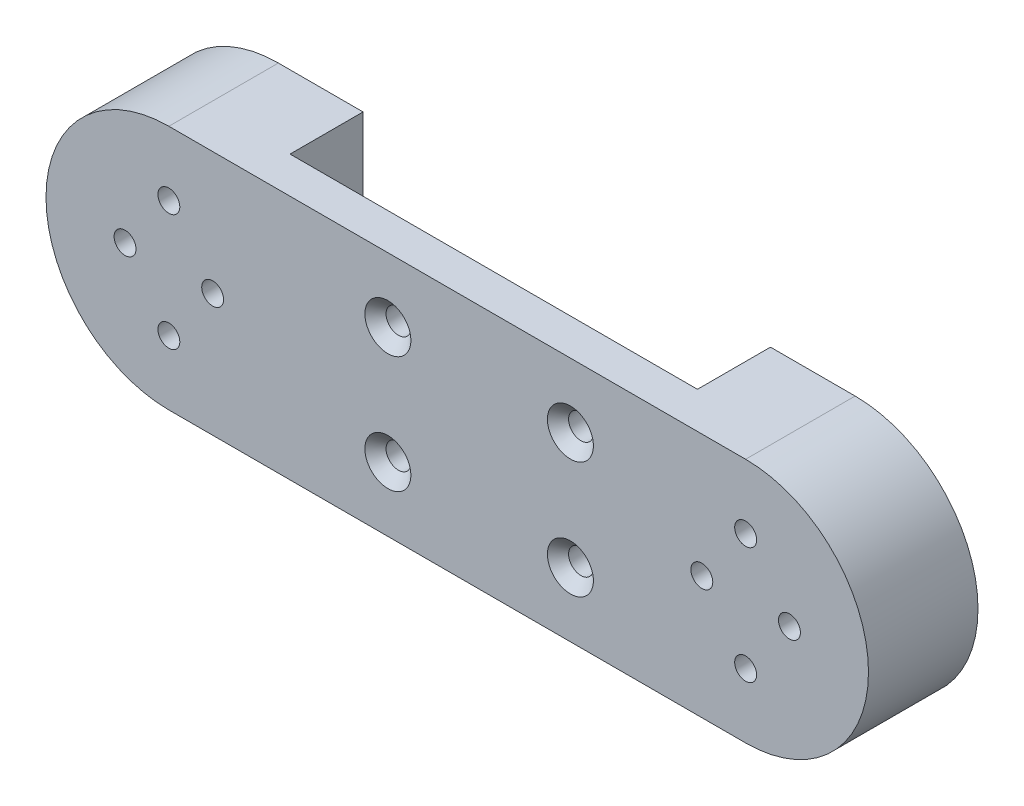
ISO-10303-21;
HEADER;
FILE_DESCRIPTION(('STEP AP214'),'2;1');
FILE_NAME('part.step','',(''),(''),'','','');
FILE_SCHEMA(('AUTOMOTIVE_DESIGN { 1 0 10303 214 1 1 1 1 }'));
ENDSEC;
DATA;
#1=APPLICATION_CONTEXT('core data for automotive mechanical design processes');
#2=APPLICATION_PROTOCOL_DEFINITION('international standard','automotive_design',2000,#1);
#3=PRODUCT_CONTEXT('',#1,'mechanical');
#4=PRODUCT('Part','Part','',(#3));
#5=PRODUCT_RELATED_PRODUCT_CATEGORY('part','',(#4));
#6=PRODUCT_DEFINITION_FORMATION('','',#4);
#7=PRODUCT_DEFINITION_CONTEXT('part definition',#1,'design');
#8=PRODUCT_DEFINITION('design','',#6,#7);
#9=PRODUCT_DEFINITION_SHAPE('','',#8);
#10=(LENGTH_UNIT() NAMED_UNIT(*) SI_UNIT(.MILLI.,.METRE.));
#11=(NAMED_UNIT(*) PLANE_ANGLE_UNIT() SI_UNIT($,.RADIAN.));
#12=(NAMED_UNIT(*) SI_UNIT($,.STERADIAN.) SOLID_ANGLE_UNIT());
#13=UNCERTAINTY_MEASURE_WITH_UNIT(LENGTH_MEASURE(1.E-05),#10,'distance_accuracy_value','');
#14=(GEOMETRIC_REPRESENTATION_CONTEXT(3) GLOBAL_UNCERTAINTY_ASSIGNED_CONTEXT((#13)) GLOBAL_UNIT_ASSIGNED_CONTEXT((#10,
#11,#12)) REPRESENTATION_CONTEXT('',''));
#15=CARTESIAN_POINT('',(0.,0.,0.));
#16=DIRECTION('',(0.,0.,1.));
#17=DIRECTION('',(1.,0.,0.));
#18=AXIS2_PLACEMENT_3D('',#15,#16,#17);
#19=CARTESIAN_POINT('',(0.,0.,0.));
#20=DIRECTION('',(0.,0.,1.));
#21=DIRECTION('',(1.,0.,0.));
#22=AXIS2_PLACEMENT_3D('',#19,#20,#21);
#23=PLANE('',#22);
#24=CARTESIAN_POINT('',(-9.5,8.,0.));
#25=DIRECTION('',(0.,0.,1.));
#26=DIRECTION('',(1.,0.,0.));
#27=AXIS2_PLACEMENT_3D('',#24,#25,#26);
#28=CIRCLE('',#27,1.7);
#29=CARTESIAN_POINT('',(-7.8,8.,0.));
#30=VERTEX_POINT('',#29);
#31=EDGE_CURVE('E49',#30,#30,#28,.T.);
#32=ORIENTED_EDGE('',*,*,#31,.T.);
#33=EDGE_LOOP('',(#32));
#34=FACE_BOUND('',#33,.T.);
#35=CARTESIAN_POINT('',(15.5,8.,0.));
#36=DIRECTION('',(0.,0.,1.));
#37=DIRECTION('',(1.,0.,0.));
#38=AXIS2_PLACEMENT_3D('',#35,#36,#37);
#39=CIRCLE('',#38,1.7);
#40=CARTESIAN_POINT('',(17.2,8.,0.));
#41=VERTEX_POINT('',#40);
#42=EDGE_CURVE('E221',#41,#41,#39,.T.);
#43=ORIENTED_EDGE('',*,*,#42,.T.);
#44=EDGE_LOOP('',(#43));
#45=FACE_BOUND('',#44,.T.);
#46=CARTESIAN_POINT('',(15.5,-8.,0.));
#47=DIRECTION('',(0.,0.,1.));
#48=DIRECTION('',(1.,0.,0.));
#49=AXIS2_PLACEMENT_3D('',#46,#47,#48);
#50=CIRCLE('',#49,1.7);
#51=CARTESIAN_POINT('',(17.2,-8.,0.));
#52=VERTEX_POINT('',#51);
#53=EDGE_CURVE('E217',#52,#52,#50,.T.);
#54=ORIENTED_EDGE('',*,*,#53,.T.);
#55=EDGE_LOOP('',(#54));
#56=FACE_BOUND('',#55,.T.);
#57=CARTESIAN_POINT('',(-9.5,-8.,0.));
#58=DIRECTION('',(0.,0.,1.));
#59=DIRECTION('',(1.,0.,0.));
#60=AXIS2_PLACEMENT_3D('',#57,#58,#59);
#61=CIRCLE('',#60,1.7);
#62=CARTESIAN_POINT('',(-7.8,-8.,0.));
#63=VERTEX_POINT('',#62);
#64=EDGE_CURVE('E212',#63,#63,#61,.T.);
#65=ORIENTED_EDGE('',*,*,#64,.T.);
#66=EDGE_LOOP('',(#65));
#67=FACE_BOUND('',#66,.T.);
#68=DIRECTION('',(0.,-1.,0.));
#69=VECTOR('',#68,1.);
#70=CARTESIAN_POINT('',(-27.9,0.,0.));
#71=LINE('',#70,#69);
#72=CARTESIAN_POINT('',(-27.9,16.8266712267679,0.));
#73=VERTEX_POINT('',#72);
#74=CARTESIAN_POINT('',(-27.9,-16.8266712267679,0.));
#75=VERTEX_POINT('',#74);
#76=EDGE_CURVE('E215',#73,#75,#71,.T.);
#77=ORIENTED_EDGE('',*,*,#76,.F.);
#78=DIRECTION('',(1.,0.,0.));
#79=VECTOR('',#78,1.);
#80=CARTESIAN_POINT('',(0.,16.8266712267679,0.));
#81=LINE('',#80,#79);
#82=CARTESIAN_POINT('',(27.9,16.8266712267679,0.));
#83=VERTEX_POINT('',#82);
#84=EDGE_CURVE('E138',#73,#83,#81,.T.);
#85=ORIENTED_EDGE('',*,*,#84,.T.);
#86=DIRECTION('',(0.,-1.,0.));
#87=VECTOR('',#86,1.);
#88=CARTESIAN_POINT('',(27.9,0.,0.));
#89=LINE('',#88,#87);
#90=CARTESIAN_POINT('',(27.9,-16.8266712267679,0.));
#91=VERTEX_POINT('',#90);
#92=EDGE_CURVE('E139',#83,#91,#89,.T.);
#93=ORIENTED_EDGE('',*,*,#92,.T.);
#94=DIRECTION('',(1.,0.,0.));
#95=VECTOR('',#94,1.);
#96=CARTESIAN_POINT('',(0.,-16.8266712267679,0.));
#97=LINE('',#96,#95);
#98=EDGE_CURVE('E62',#75,#91,#97,.T.);
#99=ORIENTED_EDGE('',*,*,#98,.F.);
#100=EDGE_LOOP('',(#77,#85,#93,#99));
#101=FACE_BOUND('',#100,.T.);
#102=ADVANCED_FACE('F45',(#34,#45,#56,#67,#101),#23,.F.);
#103=CARTESIAN_POINT('',(0.,-16.8266712267679,5.));
#104=DIRECTION('',(0.,1.,0.));
#105=DIRECTION('',(-1.,0.,0.));
#106=AXIS2_PLACEMENT_3D('',#103,#104,#105);
#107=PLANE('',#106);
#108=DIRECTION('',(0.,0.,-1.));
#109=VECTOR('',#108,1.);
#110=CARTESIAN_POINT('',(-39.5,-16.8266712267679,5.));
#111=LINE('',#110,#109);
#112=CARTESIAN_POINT('',(-39.5,-16.8266712267679,5.));
#113=VERTEX_POINT('',#112);
#114=CARTESIAN_POINT('',(-39.5,-16.8266712267679,-10.));
#115=VERTEX_POINT('',#114);
#116=EDGE_CURVE('E205',#113,#115,#111,.T.);
#117=ORIENTED_EDGE('',*,*,#116,.T.);
#118=DIRECTION('',(-1.,0.,0.));
#119=VECTOR('',#118,1.);
#120=CARTESIAN_POINT('',(0.,-16.8266712267679,-10.));
#121=LINE('',#120,#119);
#122=CARTESIAN_POINT('',(-27.9,-16.8266712267679,-10.));
#123=VERTEX_POINT('',#122);
#124=EDGE_CURVE('E124',#123,#115,#121,.T.);
#125=ORIENTED_EDGE('',*,*,#124,.F.);
#126=DIRECTION('',(0.,0.,1.));
#127=VECTOR('',#126,1.);
#128=CARTESIAN_POINT('',(-27.9,-16.8266712267679,-10.));
#129=LINE('',#128,#127);
#130=EDGE_CURVE('E120',#123,#75,#129,.T.);
#131=ORIENTED_EDGE('',*,*,#130,.T.);
#132=ORIENTED_EDGE('',*,*,#98,.T.);
#133=DIRECTION('',(0.,0.,1.));
#134=VECTOR('',#133,1.);
#135=CARTESIAN_POINT('',(27.9,-16.8266712267679,-10.));
#136=LINE('',#135,#134);
#137=CARTESIAN_POINT('',(27.9,-16.8266712267679,-10.));
#138=VERTEX_POINT('',#137);
#139=EDGE_CURVE('E168',#138,#91,#136,.T.);
#140=ORIENTED_EDGE('',*,*,#139,.F.);
#141=DIRECTION('',(-1.,0.,0.));
#142=VECTOR('',#141,1.);
#143=CARTESIAN_POINT('',(0.,-16.8266712267679,-10.));
#144=LINE('',#143,#142);
#145=CARTESIAN_POINT('',(39.5,-16.8266712267679,-10.));
#146=VERTEX_POINT('',#145);
#147=EDGE_CURVE('E155',#146,#138,#144,.T.);
#148=ORIENTED_EDGE('',*,*,#147,.F.);
#149=DIRECTION('',(0.,0.,-1.));
#150=VECTOR('',#149,1.);
#151=CARTESIAN_POINT('',(39.5,-16.8266712267679,5.));
#152=LINE('',#151,#150);
#153=CARTESIAN_POINT('',(39.5,-16.8266712267679,5.));
#154=VERTEX_POINT('',#153);
#155=EDGE_CURVE('E11',#154,#146,#152,.T.);
#156=ORIENTED_EDGE('',*,*,#155,.F.);
#157=DIRECTION('',(1.,0.,0.));
#158=VECTOR('',#157,1.);
#159=CARTESIAN_POINT('',(0.,-16.8266712267679,5.));
#160=LINE('',#159,#158);
#161=EDGE_CURVE('E173',#113,#154,#160,.T.);
#162=ORIENTED_EDGE('',*,*,#161,.F.);
#163=EDGE_LOOP('',(#117,#125,#131,#132,#140,#148,#156,#162));
#164=FACE_BOUND('',#163,.T.);
#165=ADVANCED_FACE('F47',(#164),#107,.F.);
#166=CARTESIAN_POINT('',(39.5,0.,5.));
#167=DIRECTION('',(0.,0.,-1.));
#168=DIRECTION('',(-1.,0.,0.));
#169=AXIS2_PLACEMENT_3D('',#166,#167,#168);
#170=CYLINDRICAL_SURFACE('',#169,16.8266712267679);
#171=ORIENTED_EDGE('',*,*,#155,.T.);
#172=CARTESIAN_POINT('',(39.5,0.,-10.));
#173=DIRECTION('',(0.,0.,-1.));
#174=DIRECTION('',(-1.,0.,0.));
#175=AXIS2_PLACEMENT_3D('',#172,#173,#174);
#176=CIRCLE('',#175,16.8266712267679);
#177=CARTESIAN_POINT('',(39.5,16.8266712267679,-10.));
#178=VERTEX_POINT('',#177);
#179=EDGE_CURVE('E152',#178,#146,#176,.T.);
#180=ORIENTED_EDGE('',*,*,#179,.F.);
#181=DIRECTION('',(0.,0.,-1.));
#182=VECTOR('',#181,1.);
#183=CARTESIAN_POINT('',(39.5,16.8266712267679,5.));
#184=LINE('',#183,#182);
#185=CARTESIAN_POINT('',(39.5,16.8266712267679,5.));
#186=VERTEX_POINT('',#185);
#187=EDGE_CURVE('E54',#186,#178,#184,.T.);
#188=ORIENTED_EDGE('',*,*,#187,.F.);
#189=CARTESIAN_POINT('',(39.5,0.,5.));
#190=DIRECTION('',(0.,0.,1.));
#191=DIRECTION('',(1.,0.,0.));
#192=AXIS2_PLACEMENT_3D('',#189,#190,#191);
#193=CIRCLE('',#192,16.8266712267679);
#194=EDGE_CURVE('E175',#154,#186,#193,.T.);
#195=ORIENTED_EDGE('',*,*,#194,.F.);
#196=EDGE_LOOP('',(#171,#180,#188,#195));
#197=FACE_BOUND('',#196,.T.);
#198=ADVANCED_FACE('F271',(#197),#170,.T.);
#199=CARTESIAN_POINT('',(0.,16.8266712267679,5.));
#200=DIRECTION('',(0.,1.,0.));
#201=DIRECTION('',(-1.,0.,0.));
#202=AXIS2_PLACEMENT_3D('',#199,#200,#201);
#203=PLANE('',#202);
#204=ORIENTED_EDGE('',*,*,#84,.F.);
#205=DIRECTION('',(0.,0.,1.));
#206=VECTOR('',#205,1.);
#207=CARTESIAN_POINT('',(-27.9,16.8266712267679,-10.));
#208=LINE('',#207,#206);
#209=CARTESIAN_POINT('',(-27.9,16.8266712267679,-10.));
#210=VERTEX_POINT('',#209);
#211=EDGE_CURVE('E118',#210,#73,#208,.T.);
#212=ORIENTED_EDGE('',*,*,#211,.F.);
#213=DIRECTION('',(1.,0.,0.));
#214=VECTOR('',#213,1.);
#215=CARTESIAN_POINT('',(0.,16.8266712267679,-10.));
#216=LINE('',#215,#214);
#217=CARTESIAN_POINT('',(-39.5,16.8266712267679,-10.));
#218=VERTEX_POINT('',#217);
#219=EDGE_CURVE('E125',#218,#210,#216,.T.);
#220=ORIENTED_EDGE('',*,*,#219,.F.);
#221=DIRECTION('',(0.,0.,-1.));
#222=VECTOR('',#221,1.);
#223=CARTESIAN_POINT('',(-39.5,16.8266712267679,5.));
#224=LINE('',#223,#222);
#225=CARTESIAN_POINT('',(-39.5,16.8266712267679,5.));
#226=VERTEX_POINT('',#225);
#227=EDGE_CURVE('E209',#226,#218,#224,.T.);
#228=ORIENTED_EDGE('',*,*,#227,.F.);
#229=DIRECTION('',(1.,0.,0.));
#230=VECTOR('',#229,1.);
#231=CARTESIAN_POINT('',(0.,16.8266712267679,5.));
#232=LINE('',#231,#230);
#233=EDGE_CURVE('E177',#226,#186,#232,.T.);
#234=ORIENTED_EDGE('',*,*,#233,.T.);
#235=ORIENTED_EDGE('',*,*,#187,.T.);
#236=DIRECTION('',(1.,0.,0.));
#237=VECTOR('',#236,1.);
#238=CARTESIAN_POINT('',(0.,16.8266712267679,-10.));
#239=LINE('',#238,#237);
#240=CARTESIAN_POINT('',(27.9,16.8266712267679,-10.));
#241=VERTEX_POINT('',#240);
#242=EDGE_CURVE('E149',#241,#178,#239,.T.);
#243=ORIENTED_EDGE('',*,*,#242,.F.);
#244=DIRECTION('',(0.,0.,1.));
#245=VECTOR('',#244,1.);
#246=CARTESIAN_POINT('',(27.9,16.8266712267679,-10.));
#247=LINE('',#246,#245);
#248=EDGE_CURVE('E171',#241,#83,#247,.T.);
#249=ORIENTED_EDGE('',*,*,#248,.T.);
#250=EDGE_LOOP('',(#204,#212,#220,#228,#234,#235,#243,#249));
#251=FACE_BOUND('',#250,.T.);
#252=ADVANCED_FACE('F136',(#251),#203,.T.);
#253=CARTESIAN_POINT('',(39.5,8.,5.));
#254=DIRECTION('',(0.,0.,-1.));
#255=DIRECTION('',(-1.,0.,0.));
#256=AXIS2_PLACEMENT_3D('',#253,#254,#255);
#257=CYLINDRICAL_SURFACE('',#256,1.5);
#258=CARTESIAN_POINT('',(39.5,8.,5.));
#259=DIRECTION('',(0.,0.,1.));
#260=DIRECTION('',(1.,0.,0.));
#261=AXIS2_PLACEMENT_3D('',#258,#259,#260);
#262=CIRCLE('',#261,1.5);
#263=CARTESIAN_POINT('',(41.,8.,5.));
#264=VERTEX_POINT('',#263);
#265=EDGE_CURVE('E199',#264,#264,#262,.T.);
#266=ORIENTED_EDGE('',*,*,#265,.T.);
#267=EDGE_LOOP('',(#266));
#268=FACE_BOUND('',#267,.T.);
#269=CARTESIAN_POINT('',(39.5,8.,-10.));
#270=DIRECTION('',(0.,0.,-1.));
#271=DIRECTION('',(-1.,0.,0.));
#272=AXIS2_PLACEMENT_3D('',#269,#270,#271);
#273=CIRCLE('',#272,1.5);
#274=CARTESIAN_POINT('',(38.,8.,-10.));
#275=VERTEX_POINT('',#274);
#276=EDGE_CURVE('E160',#275,#275,#273,.F.);
#277=ORIENTED_EDGE('',*,*,#276,.F.);
#278=EDGE_LOOP('',(#277));
#279=FACE_BOUND('',#278,.T.);
#280=ADVANCED_FACE('F300',(#268,#279),#257,.F.);
#281=CARTESIAN_POINT('',(45.5,0.,5.));
#282=DIRECTION('',(0.,0.,-1.));
#283=DIRECTION('',(-1.,0.,0.));
#284=AXIS2_PLACEMENT_3D('',#281,#282,#283);
#285=CYLINDRICAL_SURFACE('',#284,1.5);
#286=CARTESIAN_POINT('',(45.5,0.,5.));
#287=DIRECTION('',(0.,0.,1.));
#288=DIRECTION('',(1.,0.,0.));
#289=AXIS2_PLACEMENT_3D('',#286,#287,#288);
#290=CIRCLE('',#289,1.5);
#291=CARTESIAN_POINT('',(47.,0.,5.));
#292=VERTEX_POINT('',#291);
#293=EDGE_CURVE('E196',#292,#292,#290,.T.);
#294=ORIENTED_EDGE('',*,*,#293,.T.);
#295=EDGE_LOOP('',(#294));
#296=FACE_BOUND('',#295,.T.);
#297=CARTESIAN_POINT('',(45.5,0.,-10.));
#298=DIRECTION('',(0.,0.,-1.));
#299=DIRECTION('',(-1.,0.,0.));
#300=AXIS2_PLACEMENT_3D('',#297,#298,#299);
#301=CIRCLE('',#300,1.5);
#302=CARTESIAN_POINT('',(44.,0.,-10.));
#303=VERTEX_POINT('',#302);
#304=EDGE_CURVE('E166',#303,#303,#301,.F.);
#305=ORIENTED_EDGE('',*,*,#304,.F.);
#306=EDGE_LOOP('',(#305));
#307=FACE_BOUND('',#306,.T.);
#308=ADVANCED_FACE('F303',(#296,#307),#285,.F.);
#309=CARTESIAN_POINT('',(39.5,-8.,5.));
#310=DIRECTION('',(0.,0.,-1.));
#311=DIRECTION('',(-1.,0.,0.));
#312=AXIS2_PLACEMENT_3D('',#309,#310,#311);
#313=CYLINDRICAL_SURFACE('',#312,1.5);
#314=CARTESIAN_POINT('',(39.5,-8.,5.));
#315=DIRECTION('',(0.,0.,1.));
#316=DIRECTION('',(1.,0.,0.));
#317=AXIS2_PLACEMENT_3D('',#314,#315,#316);
#318=CIRCLE('',#317,1.5);
#319=CARTESIAN_POINT('',(41.,-8.,5.));
#320=VERTEX_POINT('',#319);
#321=EDGE_CURVE('E193',#320,#320,#318,.T.);
#322=ORIENTED_EDGE('',*,*,#321,.T.);
#323=EDGE_LOOP('',(#322));
#324=FACE_BOUND('',#323,.T.);
#325=CARTESIAN_POINT('',(39.5,-8.,-10.));
#326=DIRECTION('',(0.,0.,-1.));
#327=DIRECTION('',(-1.,0.,0.));
#328=AXIS2_PLACEMENT_3D('',#325,#326,#327);
#329=CIRCLE('',#328,1.5);
#330=CARTESIAN_POINT('',(38.,-8.,-10.));
#331=VERTEX_POINT('',#330);
#332=EDGE_CURVE('E157',#331,#331,#329,.F.);
#333=ORIENTED_EDGE('',*,*,#332,.F.);
#334=EDGE_LOOP('',(#333));
#335=FACE_BOUND('',#334,.T.);
#336=ADVANCED_FACE('F307',(#324,#335),#313,.F.);
#337=CARTESIAN_POINT('',(-39.5,8.,5.));
#338=DIRECTION('',(0.,0.,-1.));
#339=DIRECTION('',(-1.,0.,0.));
#340=AXIS2_PLACEMENT_3D('',#337,#338,#339);
#341=CYLINDRICAL_SURFACE('',#340,1.5);
#342=CARTESIAN_POINT('',(-39.5,8.,5.));
#343=DIRECTION('',(0.,0.,1.));
#344=DIRECTION('',(1.,0.,0.));
#345=AXIS2_PLACEMENT_3D('',#342,#343,#344);
#346=CIRCLE('',#345,1.5);
#347=CARTESIAN_POINT('',(-38.,8.,5.));
#348=VERTEX_POINT('',#347);
#349=EDGE_CURVE('E190',#348,#348,#346,.T.);
#350=ORIENTED_EDGE('',*,*,#349,.T.);
#351=EDGE_LOOP('',(#350));
#352=FACE_BOUND('',#351,.T.);
#353=CARTESIAN_POINT('',(-39.5,8.,-10.));
#354=DIRECTION('',(0.,0.,-1.));
#355=DIRECTION('',(-1.,0.,0.));
#356=AXIS2_PLACEMENT_3D('',#353,#354,#355);
#357=CIRCLE('',#356,1.5);
#358=CARTESIAN_POINT('',(-41.,8.,-10.));
#359=VERTEX_POINT('',#358);
#360=EDGE_CURVE('E247',#359,#359,#357,.F.);
#361=ORIENTED_EDGE('',*,*,#360,.F.);
#362=EDGE_LOOP('',(#361));
#363=FACE_BOUND('',#362,.T.);
#364=ADVANCED_FACE('F311',(#352,#363),#341,.F.);
#365=CARTESIAN_POINT('',(-45.5,0.,5.));
#366=DIRECTION('',(0.,0.,-1.));
#367=DIRECTION('',(-1.,0.,0.));
#368=AXIS2_PLACEMENT_3D('',#365,#366,#367);
#369=CYLINDRICAL_SURFACE('',#368,1.5);
#370=CARTESIAN_POINT('',(-45.5,0.,5.));
#371=DIRECTION('',(0.,0.,1.));
#372=DIRECTION('',(1.,0.,0.));
#373=AXIS2_PLACEMENT_3D('',#370,#371,#372);
#374=CIRCLE('',#373,1.5);
#375=CARTESIAN_POINT('',(-44.,0.,5.));
#376=VERTEX_POINT('',#375);
#377=EDGE_CURVE('E187',#376,#376,#374,.T.);
#378=ORIENTED_EDGE('',*,*,#377,.T.);
#379=EDGE_LOOP('',(#378));
#380=FACE_BOUND('',#379,.T.);
#381=CARTESIAN_POINT('',(-45.5,0.,-10.));
#382=DIRECTION('',(0.,0.,-1.));
#383=DIRECTION('',(-1.,0.,0.));
#384=AXIS2_PLACEMENT_3D('',#381,#382,#383);
#385=CIRCLE('',#384,1.5);
#386=CARTESIAN_POINT('',(-47.,0.,-10.));
#387=VERTEX_POINT('',#386);
#388=EDGE_CURVE('E250',#387,#387,#385,.F.);
#389=ORIENTED_EDGE('',*,*,#388,.F.);
#390=EDGE_LOOP('',(#389));
#391=FACE_BOUND('',#390,.T.);
#392=ADVANCED_FACE('F315',(#380,#391),#369,.F.);
#393=CARTESIAN_POINT('',(-39.5,-8.,5.));
#394=DIRECTION('',(0.,0.,-1.));
#395=DIRECTION('',(-1.,0.,0.));
#396=AXIS2_PLACEMENT_3D('',#393,#394,#395);
#397=CYLINDRICAL_SURFACE('',#396,1.5);
#398=CARTESIAN_POINT('',(-39.5,-8.,5.));
#399=DIRECTION('',(0.,0.,1.));
#400=DIRECTION('',(1.,0.,0.));
#401=AXIS2_PLACEMENT_3D('',#398,#399,#400);
#402=CIRCLE('',#401,1.5);
#403=CARTESIAN_POINT('',(-38.,-8.,5.));
#404=VERTEX_POINT('',#403);
#405=EDGE_CURVE('E184',#404,#404,#402,.T.);
#406=ORIENTED_EDGE('',*,*,#405,.T.);
#407=EDGE_LOOP('',(#406));
#408=FACE_BOUND('',#407,.T.);
#409=CARTESIAN_POINT('',(-39.5,-8.,-10.));
#410=DIRECTION('',(0.,0.,-1.));
#411=DIRECTION('',(-1.,0.,0.));
#412=AXIS2_PLACEMENT_3D('',#409,#410,#411);
#413=CIRCLE('',#412,1.5);
#414=CARTESIAN_POINT('',(-41.,-8.,-10.));
#415=VERTEX_POINT('',#414);
#416=EDGE_CURVE('E244',#415,#415,#413,.F.);
#417=ORIENTED_EDGE('',*,*,#416,.F.);
#418=EDGE_LOOP('',(#417));
#419=FACE_BOUND('',#418,.T.);
#420=ADVANCED_FACE('F286',(#408,#419),#397,.F.);
#421=CARTESIAN_POINT('',(-33.5,0.,5.));
#422=DIRECTION('',(0.,0.,-1.));
#423=DIRECTION('',(-1.,0.,0.));
#424=AXIS2_PLACEMENT_3D('',#421,#422,#423);
#425=CYLINDRICAL_SURFACE('',#424,1.5);
#426=CARTESIAN_POINT('',(-33.5,0.,5.));
#427=DIRECTION('',(0.,0.,1.));
#428=DIRECTION('',(1.,0.,0.));
#429=AXIS2_PLACEMENT_3D('',#426,#427,#428);
#430=CIRCLE('',#429,1.5);
#431=CARTESIAN_POINT('',(-32.,0.,5.));
#432=VERTEX_POINT('',#431);
#433=EDGE_CURVE('E181',#432,#432,#430,.T.);
#434=ORIENTED_EDGE('',*,*,#433,.T.);
#435=EDGE_LOOP('',(#434));
#436=FACE_BOUND('',#435,.T.);
#437=CARTESIAN_POINT('',(-33.5,0.,-10.));
#438=DIRECTION('',(0.,0.,-1.));
#439=DIRECTION('',(-1.,0.,0.));
#440=AXIS2_PLACEMENT_3D('',#437,#438,#439);
#441=CIRCLE('',#440,1.5);
#442=CARTESIAN_POINT('',(-35.,0.,-10.));
#443=VERTEX_POINT('',#442);
#444=EDGE_CURVE('E133',#443,#443,#441,.F.);
#445=ORIENTED_EDGE('',*,*,#444,.F.);
#446=EDGE_LOOP('',(#445));
#447=FACE_BOUND('',#446,.T.);
#448=ADVANCED_FACE('F278',(#436,#447),#425,.F.);
#449=CARTESIAN_POINT('',(-39.5,0.,5.));
#450=DIRECTION('',(0.,0.,-1.));
#451=DIRECTION('',(-1.,0.,0.));
#452=AXIS2_PLACEMENT_3D('',#449,#450,#451);
#453=CYLINDRICAL_SURFACE('',#452,16.8266712267679);
#454=ORIENTED_EDGE('',*,*,#227,.T.);
#455=CARTESIAN_POINT('',(-39.5,0.,-10.));
#456=DIRECTION('',(0.,0.,-1.));
#457=DIRECTION('',(-1.,0.,0.));
#458=AXIS2_PLACEMENT_3D('',#455,#456,#457);
#459=CIRCLE('',#458,16.8266712267679);
#460=EDGE_CURVE('E131',#115,#218,#459,.T.);
#461=ORIENTED_EDGE('',*,*,#460,.F.);
#462=ORIENTED_EDGE('',*,*,#116,.F.);
#463=CARTESIAN_POINT('',(-39.5,0.,5.));
#464=DIRECTION('',(0.,0.,1.));
#465=DIRECTION('',(1.,0.,0.));
#466=AXIS2_PLACEMENT_3D('',#463,#464,#465);
#467=CIRCLE('',#466,16.8266712267679);
#468=EDGE_CURVE('E70',#226,#113,#467,.T.);
#469=ORIENTED_EDGE('',*,*,#468,.F.);
#470=EDGE_LOOP('',(#454,#461,#462,#469));
#471=FACE_BOUND('',#470,.T.);
#472=ADVANCED_FACE('F275',(#471),#453,.T.);
#473=CARTESIAN_POINT('',(33.5,0.,5.));
#474=DIRECTION('',(0.,0.,-1.));
#475=DIRECTION('',(-1.,0.,0.));
#476=AXIS2_PLACEMENT_3D('',#473,#474,#475);
#477=CYLINDRICAL_SURFACE('',#476,1.5);
#478=CARTESIAN_POINT('',(33.5,0.,5.));
#479=DIRECTION('',(0.,0.,1.));
#480=DIRECTION('',(1.,0.,0.));
#481=AXIS2_PLACEMENT_3D('',#478,#479,#480);
#482=CIRCLE('',#481,1.5);
#483=CARTESIAN_POINT('',(35.,0.,5.));
#484=VERTEX_POINT('',#483);
#485=EDGE_CURVE('E202',#484,#484,#482,.T.);
#486=ORIENTED_EDGE('',*,*,#485,.T.);
#487=EDGE_LOOP('',(#486));
#488=FACE_BOUND('',#487,.T.);
#489=CARTESIAN_POINT('',(33.5,0.,-10.));
#490=DIRECTION('',(0.,0.,-1.));
#491=DIRECTION('',(-1.,0.,0.));
#492=AXIS2_PLACEMENT_3D('',#489,#490,#491);
#493=CIRCLE('',#492,1.5);
#494=CARTESIAN_POINT('',(32.,0.,-10.));
#495=VERTEX_POINT('',#494);
#496=EDGE_CURVE('E163',#495,#495,#493,.F.);
#497=ORIENTED_EDGE('',*,*,#496,.F.);
#498=EDGE_LOOP('',(#497));
#499=FACE_BOUND('',#498,.T.);
#500=ADVANCED_FACE('F277',(#488,#499),#477,.F.);
#501=CARTESIAN_POINT('',(0.,0.,5.));
#502=DIRECTION('',(0.,0.,1.));
#503=DIRECTION('',(1.,0.,0.));
#504=AXIS2_PLACEMENT_3D('',#501,#502,#503);
#505=PLANE('',#504);
#506=CARTESIAN_POINT('',(-9.5,8.,5.));
#507=DIRECTION('',(0.,0.,1.));
#508=DIRECTION('',(1.,0.,0.));
#509=AXIS2_PLACEMENT_3D('',#506,#507,#508);
#510=CIRCLE('',#509,3.15);
#511=CARTESIAN_POINT('',(-6.35,8.,5.));
#512=VERTEX_POINT('',#511);
#513=EDGE_CURVE('E361',#512,#512,#510,.T.);
#514=ORIENTED_EDGE('',*,*,#513,.F.);
#515=EDGE_LOOP('',(#514));
#516=FACE_BOUND('',#515,.T.);
#517=CARTESIAN_POINT('',(15.5,8.,5.));
#518=DIRECTION('',(0.,0.,1.));
#519=DIRECTION('',(1.,0.,0.));
#520=AXIS2_PLACEMENT_3D('',#517,#518,#519);
#521=CIRCLE('',#520,3.15);
#522=CARTESIAN_POINT('',(18.65,8.,5.));
#523=VERTEX_POINT('',#522);
#524=EDGE_CURVE('E230',#523,#523,#521,.T.);
#525=ORIENTED_EDGE('',*,*,#524,.F.);
#526=EDGE_LOOP('',(#525));
#527=FACE_BOUND('',#526,.T.);
#528=CARTESIAN_POINT('',(15.5,-8.,5.));
#529=DIRECTION('',(0.,0.,1.));
#530=DIRECTION('',(1.,0.,0.));
#531=AXIS2_PLACEMENT_3D('',#528,#529,#530);
#532=CIRCLE('',#531,3.15);
#533=CARTESIAN_POINT('',(18.65,-8.,5.));
#534=VERTEX_POINT('',#533);
#535=EDGE_CURVE('E223',#534,#534,#532,.T.);
#536=ORIENTED_EDGE('',*,*,#535,.F.);
#537=EDGE_LOOP('',(#536));
#538=FACE_BOUND('',#537,.T.);
#539=CARTESIAN_POINT('',(-9.5,-8.,5.));
#540=DIRECTION('',(0.,0.,1.));
#541=DIRECTION('',(1.,0.,0.));
#542=AXIS2_PLACEMENT_3D('',#539,#540,#541);
#543=CIRCLE('',#542,3.15);
#544=CARTESIAN_POINT('',(-6.35,-8.,5.));
#545=VERTEX_POINT('',#544);
#546=EDGE_CURVE('E219',#545,#545,#543,.T.);
#547=ORIENTED_EDGE('',*,*,#546,.F.);
#548=EDGE_LOOP('',(#547));
#549=FACE_BOUND('',#548,.T.);
#550=ORIENTED_EDGE('',*,*,#161,.T.);
#551=ORIENTED_EDGE('',*,*,#194,.T.);
#552=ORIENTED_EDGE('',*,*,#233,.F.);
#553=ORIENTED_EDGE('',*,*,#468,.T.);
#554=EDGE_LOOP('',(#550,#551,#552,#553));
#555=FACE_BOUND('',#554,.T.);
#556=ORIENTED_EDGE('',*,*,#433,.F.);
#557=EDGE_LOOP('',(#556));
#558=FACE_BOUND('',#557,.T.);
#559=ORIENTED_EDGE('',*,*,#405,.F.);
#560=EDGE_LOOP('',(#559));
#561=FACE_BOUND('',#560,.T.);
#562=ORIENTED_EDGE('',*,*,#377,.F.);
#563=EDGE_LOOP('',(#562));
#564=FACE_BOUND('',#563,.T.);
#565=ORIENTED_EDGE('',*,*,#349,.F.);
#566=EDGE_LOOP('',(#565));
#567=FACE_BOUND('',#566,.T.);
#568=ORIENTED_EDGE('',*,*,#321,.F.);
#569=EDGE_LOOP('',(#568));
#570=FACE_BOUND('',#569,.T.);
#571=ORIENTED_EDGE('',*,*,#293,.F.);
#572=EDGE_LOOP('',(#571));
#573=FACE_BOUND('',#572,.T.);
#574=ORIENTED_EDGE('',*,*,#265,.F.);
#575=EDGE_LOOP('',(#574));
#576=FACE_BOUND('',#575,.T.);
#577=ORIENTED_EDGE('',*,*,#485,.F.);
#578=EDGE_LOOP('',(#577));
#579=FACE_BOUND('',#578,.T.);
#580=ADVANCED_FACE('F272',(#516,#527,#538,#549,#555,#558,#561,#564,#567,#570,#573,#576,#579),
#505,.T.);
#581=CARTESIAN_POINT('',(27.9,0.,-10.));
#582=DIRECTION('',(-1.,0.,0.));
#583=DIRECTION('',(0.,0.,1.));
#584=AXIS2_PLACEMENT_3D('',#581,#582,#583);
#585=PLANE('',#584);
#586=ORIENTED_EDGE('',*,*,#92,.F.);
#587=ORIENTED_EDGE('',*,*,#248,.F.);
#588=DIRECTION('',(0.,-1.,0.));
#589=VECTOR('',#588,1.);
#590=CARTESIAN_POINT('',(27.9,0.,-10.));
#591=LINE('',#590,#589);
#592=EDGE_CURVE('E142',#241,#138,#591,.T.);
#593=ORIENTED_EDGE('',*,*,#592,.T.);
#594=ORIENTED_EDGE('',*,*,#139,.T.);
#595=EDGE_LOOP('',(#586,#587,#593,#594));
#596=FACE_BOUND('',#595,.T.);
#597=ADVANCED_FACE('F259',(#596),#585,.T.);
#598=CARTESIAN_POINT('',(0.,0.,-10.));
#599=DIRECTION('',(0.,0.,-1.));
#600=DIRECTION('',(-1.,0.,0.));
#601=AXIS2_PLACEMENT_3D('',#598,#599,#600);
#602=PLANE('',#601);
#603=ORIENTED_EDGE('',*,*,#592,.F.);
#604=ORIENTED_EDGE('',*,*,#242,.T.);
#605=ORIENTED_EDGE('',*,*,#179,.T.);
#606=ORIENTED_EDGE('',*,*,#147,.T.);
#607=EDGE_LOOP('',(#603,#604,#605,#606));
#608=FACE_BOUND('',#607,.T.);
#609=ORIENTED_EDGE('',*,*,#332,.T.);
#610=EDGE_LOOP('',(#609));
#611=FACE_BOUND('',#610,.T.);
#612=ORIENTED_EDGE('',*,*,#276,.T.);
#613=EDGE_LOOP('',(#612));
#614=FACE_BOUND('',#613,.T.);
#615=ORIENTED_EDGE('',*,*,#496,.T.);
#616=EDGE_LOOP('',(#615));
#617=FACE_BOUND('',#616,.T.);
#618=ORIENTED_EDGE('',*,*,#304,.T.);
#619=EDGE_LOOP('',(#618));
#620=FACE_BOUND('',#619,.T.);
#621=ADVANCED_FACE('F266',(#608,#611,#614,#617,#620),#602,.T.);
#622=CARTESIAN_POINT('',(-27.9,0.,-10.));
#623=DIRECTION('',(-1.,0.,0.));
#624=DIRECTION('',(0.,0.,1.));
#625=AXIS2_PLACEMENT_3D('',#622,#623,#624);
#626=PLANE('',#625);
#627=ORIENTED_EDGE('',*,*,#76,.T.);
#628=ORIENTED_EDGE('',*,*,#130,.F.);
#629=DIRECTION('',(0.,-1.,0.));
#630=VECTOR('',#629,1.);
#631=CARTESIAN_POINT('',(-27.9,0.,-10.));
#632=LINE('',#631,#630);
#633=EDGE_CURVE('E114',#210,#123,#632,.T.);
#634=ORIENTED_EDGE('',*,*,#633,.F.);
#635=ORIENTED_EDGE('',*,*,#211,.T.);
#636=EDGE_LOOP('',(#627,#628,#634,#635));
#637=FACE_BOUND('',#636,.T.);
#638=ADVANCED_FACE('F116',(#637),#626,.F.);
#639=CARTESIAN_POINT('',(0.,0.,-10.));
#640=DIRECTION('',(0.,0.,-1.));
#641=DIRECTION('',(-1.,0.,0.));
#642=AXIS2_PLACEMENT_3D('',#639,#640,#641);
#643=PLANE('',#642);
#644=ORIENTED_EDGE('',*,*,#416,.T.);
#645=EDGE_LOOP('',(#644));
#646=FACE_BOUND('',#645,.T.);
#647=ORIENTED_EDGE('',*,*,#360,.T.);
#648=EDGE_LOOP('',(#647));
#649=FACE_BOUND('',#648,.T.);
#650=ORIENTED_EDGE('',*,*,#388,.T.);
#651=EDGE_LOOP('',(#650));
#652=FACE_BOUND('',#651,.T.);
#653=ORIENTED_EDGE('',*,*,#444,.T.);
#654=EDGE_LOOP('',(#653));
#655=FACE_BOUND('',#654,.T.);
#656=ORIENTED_EDGE('',*,*,#219,.T.);
#657=ORIENTED_EDGE('',*,*,#633,.T.);
#658=ORIENTED_EDGE('',*,*,#124,.T.);
#659=ORIENTED_EDGE('',*,*,#460,.T.);
#660=EDGE_LOOP('',(#656,#657,#658,#659));
#661=FACE_BOUND('',#660,.T.);
#662=ADVANCED_FACE('F129',(#646,#649,#652,#655,#661),#643,.T.);
#663=CARTESIAN_POINT('',(-9.5,-8.,5.));
#664=DIRECTION('',(0.,0.,1.));
#665=DIRECTION('',(1.,0.,0.));
#666=AXIS2_PLACEMENT_3D('',#663,#664,#665);
#667=CYLINDRICAL_SURFACE('',#666,1.7);
#668=CARTESIAN_POINT('',(-9.5,-8.,3.55));
#669=DIRECTION('',(0.,0.,1.));
#670=DIRECTION('',(1.,0.,0.));
#671=AXIS2_PLACEMENT_3D('',#668,#669,#670);
#672=CIRCLE('',#671,1.7);
#673=CARTESIAN_POINT('',(-7.8,-8.,3.55));
#674=VERTEX_POINT('',#673);
#675=EDGE_CURVE('E216',#674,#674,#672,.T.);
#676=ORIENTED_EDGE('',*,*,#675,.T.);
#677=EDGE_LOOP('',(#676));
#678=FACE_BOUND('',#677,.T.);
#679=ORIENTED_EDGE('',*,*,#64,.F.);
#680=EDGE_LOOP('',(#679));
#681=FACE_BOUND('',#680,.T.);
#682=ADVANCED_FACE('F330',(#678,#681),#667,.F.);
#683=CARTESIAN_POINT('',(-9.5,-8.,5.));
#684=DIRECTION('',(0.,0.,1.));
#685=DIRECTION('',(1.,0.,0.));
#686=AXIS2_PLACEMENT_3D('',#683,#684,#685);
#687=CONICAL_SURFACE('',#686,3.15,0.785398163397449);
#688=ORIENTED_EDGE('',*,*,#675,.F.);
#689=EDGE_LOOP('',(#688));
#690=FACE_BOUND('',#689,.T.);
#691=ORIENTED_EDGE('',*,*,#546,.T.);
#692=EDGE_LOOP('',(#691));
#693=FACE_BOUND('',#692,.T.);
#694=ADVANCED_FACE('F344',(#690,#693),#687,.F.);
#695=CARTESIAN_POINT('',(15.5,-8.,5.));
#696=DIRECTION('',(0.,0.,1.));
#697=DIRECTION('',(1.,0.,0.));
#698=AXIS2_PLACEMENT_3D('',#695,#696,#697);
#699=CYLINDRICAL_SURFACE('',#698,1.7);
#700=CARTESIAN_POINT('',(15.5,-8.,3.55));
#701=DIRECTION('',(0.,0.,1.));
#702=DIRECTION('',(1.,0.,0.));
#703=AXIS2_PLACEMENT_3D('',#700,#701,#702);
#704=CIRCLE('',#703,1.7);
#705=CARTESIAN_POINT('',(17.2,-8.,3.55));
#706=VERTEX_POINT('',#705);
#707=EDGE_CURVE('E220',#706,#706,#704,.T.);
#708=ORIENTED_EDGE('',*,*,#707,.T.);
#709=EDGE_LOOP('',(#708));
#710=FACE_BOUND('',#709,.T.);
#711=ORIENTED_EDGE('',*,*,#53,.F.);
#712=EDGE_LOOP('',(#711));
#713=FACE_BOUND('',#712,.T.);
#714=ADVANCED_FACE('F369',(#710,#713),#699,.F.);
#715=CARTESIAN_POINT('',(15.5,-8.,5.));
#716=DIRECTION('',(0.,0.,1.));
#717=DIRECTION('',(1.,0.,0.));
#718=AXIS2_PLACEMENT_3D('',#715,#716,#717);
#719=CONICAL_SURFACE('',#718,3.15,0.785398163397448);
#720=ORIENTED_EDGE('',*,*,#707,.F.);
#721=EDGE_LOOP('',(#720));
#722=FACE_BOUND('',#721,.T.);
#723=ORIENTED_EDGE('',*,*,#535,.T.);
#724=EDGE_LOOP('',(#723));
#725=FACE_BOUND('',#724,.T.);
#726=ADVANCED_FACE('F374',(#722,#725),#719,.F.);
#727=CARTESIAN_POINT('',(15.5,8.,5.));
#728=DIRECTION('',(0.,0.,1.));
#729=DIRECTION('',(1.,0.,0.));
#730=AXIS2_PLACEMENT_3D('',#727,#728,#729);
#731=CYLINDRICAL_SURFACE('',#730,1.7);
#732=CARTESIAN_POINT('',(15.5,8.,3.55));
#733=DIRECTION('',(0.,0.,1.));
#734=DIRECTION('',(1.,0.,0.));
#735=AXIS2_PLACEMENT_3D('',#732,#733,#734);
#736=CIRCLE('',#735,1.7);
#737=CARTESIAN_POINT('',(17.2,8.,3.55));
#738=VERTEX_POINT('',#737);
#739=EDGE_CURVE('E224',#738,#738,#736,.T.);
#740=ORIENTED_EDGE('',*,*,#739,.T.);
#741=EDGE_LOOP('',(#740));
#742=FACE_BOUND('',#741,.T.);
#743=ORIENTED_EDGE('',*,*,#42,.F.);
#744=EDGE_LOOP('',(#743));
#745=FACE_BOUND('',#744,.T.);
#746=ADVANCED_FACE('F381',(#742,#745),#731,.F.);
#747=CARTESIAN_POINT('',(15.5,8.,5.));
#748=DIRECTION('',(0.,0.,1.));
#749=DIRECTION('',(1.,0.,0.));
#750=AXIS2_PLACEMENT_3D('',#747,#748,#749);
#751=CONICAL_SURFACE('',#750,3.15,0.785398163397448);
#752=ORIENTED_EDGE('',*,*,#739,.F.);
#753=EDGE_LOOP('',(#752));
#754=FACE_BOUND('',#753,.T.);
#755=ORIENTED_EDGE('',*,*,#524,.T.);
#756=EDGE_LOOP('',(#755));
#757=FACE_BOUND('',#756,.T.);
#758=ADVANCED_FACE('F385',(#754,#757),#751,.F.);
#759=CARTESIAN_POINT('',(-9.5,8.,5.));
#760=DIRECTION('',(0.,0.,1.));
#761=DIRECTION('',(1.,0.,0.));
#762=AXIS2_PLACEMENT_3D('',#759,#760,#761);
#763=CYLINDRICAL_SURFACE('',#762,1.7);
#764=CARTESIAN_POINT('',(-9.5,8.,3.55));
#765=DIRECTION('',(0.,0.,1.));
#766=DIRECTION('',(1.,0.,0.));
#767=AXIS2_PLACEMENT_3D('',#764,#765,#766);
#768=CIRCLE('',#767,1.7);
#769=CARTESIAN_POINT('',(-7.8,8.,3.55));
#770=VERTEX_POINT('',#769);
#771=EDGE_CURVE('E401',#770,#770,#768,.T.);
#772=ORIENTED_EDGE('',*,*,#771,.T.);
#773=EDGE_LOOP('',(#772));
#774=FACE_BOUND('',#773,.T.);
#775=ORIENTED_EDGE('',*,*,#31,.F.);
#776=EDGE_LOOP('',(#775));
#777=FACE_BOUND('',#776,.T.);
#778=ADVANCED_FACE('F388',(#774,#777),#763,.F.);
#779=CARTESIAN_POINT('',(-9.5,8.,5.));
#780=DIRECTION('',(0.,0.,1.));
#781=DIRECTION('',(1.,0.,0.));
#782=AXIS2_PLACEMENT_3D('',#779,#780,#781);
#783=CONICAL_SURFACE('',#782,3.15,0.785398163397449);
#784=ORIENTED_EDGE('',*,*,#771,.F.);
#785=EDGE_LOOP('',(#784));
#786=FACE_BOUND('',#785,.T.);
#787=ORIENTED_EDGE('',*,*,#513,.T.);
#788=EDGE_LOOP('',(#787));
#789=FACE_BOUND('',#788,.T.);
#790=ADVANCED_FACE('F392',(#786,#789),#783,.F.);
#791=CLOSED_SHELL('',(#102,#165,#198,#252,#280,#308,#336,#364,#392,#420,#448,#472,#500,#580,
#597,#621,#638,#662,#682,#694,#714,#726,#746,#758,#778,#790));
#792=MANIFOLD_SOLID_BREP('B2',#791);
#793=ADVANCED_BREP_SHAPE_REPRESENTATION('',(#18,#792),#14);
#794=SHAPE_DEFINITION_REPRESENTATION(#9,#793);
ENDSEC;
END-ISO-10303-21;
